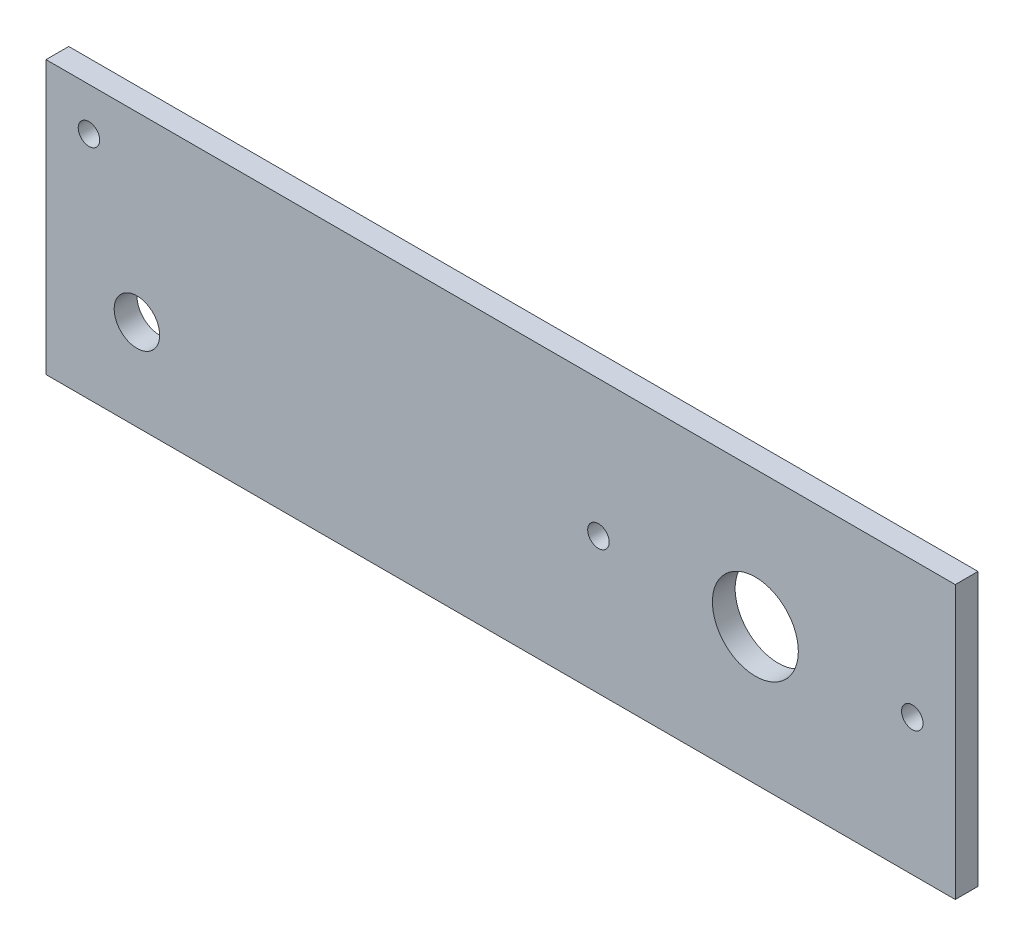
ISO-10303-21;
HEADER;
FILE_DESCRIPTION(('STEP AP214'),'2;1');
FILE_NAME('part.step','',(''),(''),'','','');
FILE_SCHEMA(('AUTOMOTIVE_DESIGN { 1 0 10303 214 1 1 1 1 }'));
ENDSEC;
DATA;
#1=APPLICATION_CONTEXT('core data for automotive mechanical design processes');
#2=APPLICATION_PROTOCOL_DEFINITION('international standard','automotive_design',2000,#1);
#3=PRODUCT_CONTEXT('',#1,'mechanical');
#4=PRODUCT('Part','Part','',(#3));
#5=PRODUCT_RELATED_PRODUCT_CATEGORY('part','',(#4));
#6=PRODUCT_DEFINITION_FORMATION('','',#4);
#7=PRODUCT_DEFINITION_CONTEXT('part definition',#1,'design');
#8=PRODUCT_DEFINITION('design','',#6,#7);
#9=PRODUCT_DEFINITION_SHAPE('','',#8);
#10=(LENGTH_UNIT() NAMED_UNIT(*) SI_UNIT(.MILLI.,.METRE.));
#11=(NAMED_UNIT(*) PLANE_ANGLE_UNIT() SI_UNIT($,.RADIAN.));
#12=(NAMED_UNIT(*) SI_UNIT($,.STERADIAN.) SOLID_ANGLE_UNIT());
#13=UNCERTAINTY_MEASURE_WITH_UNIT(LENGTH_MEASURE(1.E-05),#10,'distance_accuracy_value','');
#14=(GEOMETRIC_REPRESENTATION_CONTEXT(3) GLOBAL_UNCERTAINTY_ASSIGNED_CONTEXT((#13)) GLOBAL_UNIT_ASSIGNED_CONTEXT((#10,
#11,#12)) REPRESENTATION_CONTEXT('',''));
#15=CARTESIAN_POINT('',(0.,0.,0.));
#16=DIRECTION('',(0.,0.,1.));
#17=DIRECTION('',(1.,0.,0.));
#18=AXIS2_PLACEMENT_3D('',#15,#16,#17);
#19=CARTESIAN_POINT('',(127.,0.,0.));
#20=DIRECTION('',(0.,0.,-1.));
#21=DIRECTION('',(-1.,0.,0.));
#22=AXIS2_PLACEMENT_3D('',#19,#20,#21);
#23=PLANE('',#22);
#24=CARTESIAN_POINT('',(6.,32.1,0.));
#25=DIRECTION('',(0.,0.,1.));
#26=DIRECTION('',(1.,0.,0.));
#27=AXIS2_PLACEMENT_3D('',#24,#25,#26);
#28=CIRCLE('',#27,1.5);
#29=CARTESIAN_POINT('',(7.5,32.1,0.));
#30=VERTEX_POINT('',#29);
#31=EDGE_CURVE('E133',#30,#30,#28,.T.);
#32=ORIENTED_EDGE('',*,*,#31,.F.);
#33=EDGE_LOOP('',(#32));
#34=FACE_BOUND('',#33,.T.);
#35=CARTESIAN_POINT('',(77.159379566434,19.05,0.));
#36=DIRECTION('',(0.,0.,1.));
#37=DIRECTION('',(1.,0.,0.));
#38=AXIS2_PLACEMENT_3D('',#35,#36,#37);
#39=CIRCLE('',#38,1.5);
#40=CARTESIAN_POINT('',(78.659379566434,19.05,0.));
#41=VERTEX_POINT('',#40);
#42=EDGE_CURVE('E127',#41,#41,#39,.T.);
#43=ORIENTED_EDGE('',*,*,#42,.F.);
#44=EDGE_LOOP('',(#43));
#45=FACE_BOUND('',#44,.T.);
#46=CARTESIAN_POINT('',(99.079689783217,19.05,0.));
#47=DIRECTION('',(0.,0.,1.));
#48=DIRECTION('',(1.,0.,0.));
#49=AXIS2_PLACEMENT_3D('',#46,#47,#48);
#50=CIRCLE('',#49,6.);
#51=CARTESIAN_POINT('',(105.079689783217,19.05,0.));
#52=VERTEX_POINT('',#51);
#53=EDGE_CURVE('E121',#52,#52,#50,.T.);
#54=ORIENTED_EDGE('',*,*,#53,.F.);
#55=EDGE_LOOP('',(#54));
#56=FACE_BOUND('',#55,.T.);
#57=CARTESIAN_POINT('',(121.,19.05,0.));
#58=DIRECTION('',(0.,0.,1.));
#59=DIRECTION('',(1.,0.,0.));
#60=AXIS2_PLACEMENT_3D('',#57,#58,#59);
#61=CIRCLE('',#60,1.5);
#62=CARTESIAN_POINT('',(122.5,19.05,0.));
#63=VERTEX_POINT('',#62);
#64=EDGE_CURVE('E115',#63,#63,#61,.T.);
#65=ORIENTED_EDGE('',*,*,#64,.F.);
#66=EDGE_LOOP('',(#65));
#67=FACE_BOUND('',#66,.T.);
#68=CARTESIAN_POINT('',(12.7,12.7,0.));
#69=DIRECTION('',(0.,0.,1.));
#70=DIRECTION('',(1.,0.,0.));
#71=AXIS2_PLACEMENT_3D('',#68,#69,#70);
#72=CIRCLE('',#71,3.175);
#73=CARTESIAN_POINT('',(15.875,12.7,0.));
#74=VERTEX_POINT('',#73);
#75=EDGE_CURVE('E109',#74,#74,#72,.T.);
#76=ORIENTED_EDGE('',*,*,#75,.F.);
#77=EDGE_LOOP('',(#76));
#78=FACE_BOUND('',#77,.T.);
#79=DIRECTION('',(0.,-1.,0.));
#80=VECTOR('',#79,1.);
#81=CARTESIAN_POINT('',(0.,0.,0.));
#82=LINE('',#81,#80);
#83=CARTESIAN_POINT('',(0.,38.1,0.));
#84=VERTEX_POINT('',#83);
#85=CARTESIAN_POINT('',(0.,0.,0.));
#86=VERTEX_POINT('',#85);
#87=EDGE_CURVE('E95',#84,#86,#82,.T.);
#88=ORIENTED_EDGE('',*,*,#87,.T.);
#89=DIRECTION('',(-1.,0.,0.));
#90=VECTOR('',#89,1.);
#91=CARTESIAN_POINT('',(127.,0.,0.));
#92=LINE('',#91,#90);
#93=CARTESIAN_POINT('',(127.,0.,0.));
#94=VERTEX_POINT('',#93);
#95=EDGE_CURVE('E11',#94,#86,#92,.T.);
#96=ORIENTED_EDGE('',*,*,#95,.F.);
#97=DIRECTION('',(0.,-1.,0.));
#98=VECTOR('',#97,1.);
#99=CARTESIAN_POINT('',(127.,0.,0.));
#100=LINE('',#99,#98);
#101=CARTESIAN_POINT('',(127.,38.1,0.));
#102=VERTEX_POINT('',#101);
#103=EDGE_CURVE('E83',#102,#94,#100,.T.);
#104=ORIENTED_EDGE('',*,*,#103,.F.);
#105=DIRECTION('',(-1.,0.,0.));
#106=VECTOR('',#105,1.);
#107=CARTESIAN_POINT('',(127.,38.1,0.));
#108=LINE('',#107,#106);
#109=EDGE_CURVE('E91',#102,#84,#108,.T.);
#110=ORIENTED_EDGE('',*,*,#109,.T.);
#111=EDGE_LOOP('',(#88,#96,#104,#110));
#112=FACE_BOUND('',#111,.T.);
#113=ADVANCED_FACE('F32',(#34,#45,#56,#67,#78,#112),#23,.F.);
#114=CARTESIAN_POINT('',(127.,0.,0.));
#115=DIRECTION('',(0.,1.,0.));
#116=DIRECTION('',(0.,0.,1.));
#117=AXIS2_PLACEMENT_3D('',#114,#115,#116);
#118=PLANE('',#117);
#119=DIRECTION('',(0.,0.,-1.));
#120=VECTOR('',#119,1.);
#121=CARTESIAN_POINT('',(0.,0.,0.));
#122=LINE('',#121,#120);
#123=CARTESIAN_POINT('',(0.,0.,-3.175));
#124=VERTEX_POINT('',#123);
#125=EDGE_CURVE('E87',#86,#124,#122,.T.);
#126=ORIENTED_EDGE('',*,*,#125,.T.);
#127=DIRECTION('',(-1.,0.,0.));
#128=VECTOR('',#127,1.);
#129=CARTESIAN_POINT('',(127.,0.,-3.175));
#130=LINE('',#129,#128);
#131=CARTESIAN_POINT('',(127.,0.,-3.175));
#132=VERTEX_POINT('',#131);
#133=EDGE_CURVE('E40',#132,#124,#130,.T.);
#134=ORIENTED_EDGE('',*,*,#133,.F.);
#135=DIRECTION('',(0.,0.,-1.));
#136=VECTOR('',#135,1.);
#137=CARTESIAN_POINT('',(127.,0.,0.));
#138=LINE('',#137,#136);
#139=EDGE_CURVE('E78',#94,#132,#138,.T.);
#140=ORIENTED_EDGE('',*,*,#139,.F.);
#141=ORIENTED_EDGE('',*,*,#95,.T.);
#142=EDGE_LOOP('',(#126,#134,#140,#141));
#143=FACE_BOUND('',#142,.T.);
#144=ADVANCED_FACE('F86',(#143),#118,.F.);
#145=CARTESIAN_POINT('',(127.,0.,-3.175));
#146=DIRECTION('',(0.,0.,1.));
#147=DIRECTION('',(0.,-1.,0.));
#148=AXIS2_PLACEMENT_3D('',#145,#146,#147);
#149=PLANE('',#148);
#150=CARTESIAN_POINT('',(6.,32.1,-3.175));
#151=DIRECTION('',(0.,0.,1.));
#152=DIRECTION('',(1.,0.,0.));
#153=AXIS2_PLACEMENT_3D('',#150,#151,#152);
#154=CIRCLE('',#153,1.5);
#155=CARTESIAN_POINT('',(7.5,32.1,-3.175));
#156=VERTEX_POINT('',#155);
#157=EDGE_CURVE('E130',#156,#156,#154,.T.);
#158=ORIENTED_EDGE('',*,*,#157,.T.);
#159=EDGE_LOOP('',(#158));
#160=FACE_BOUND('',#159,.T.);
#161=CARTESIAN_POINT('',(77.159379566434,19.05,-3.175));
#162=DIRECTION('',(0.,0.,1.));
#163=DIRECTION('',(1.,0.,0.));
#164=AXIS2_PLACEMENT_3D('',#161,#162,#163);
#165=CIRCLE('',#164,1.5);
#166=CARTESIAN_POINT('',(78.659379566434,19.05,-3.175));
#167=VERTEX_POINT('',#166);
#168=EDGE_CURVE('E124',#167,#167,#165,.T.);
#169=ORIENTED_EDGE('',*,*,#168,.T.);
#170=EDGE_LOOP('',(#169));
#171=FACE_BOUND('',#170,.T.);
#172=CARTESIAN_POINT('',(99.079689783217,19.05,-3.175));
#173=DIRECTION('',(0.,0.,1.));
#174=DIRECTION('',(1.,0.,0.));
#175=AXIS2_PLACEMENT_3D('',#172,#173,#174);
#176=CIRCLE('',#175,6.);
#177=CARTESIAN_POINT('',(105.079689783217,19.05,-3.175));
#178=VERTEX_POINT('',#177);
#179=EDGE_CURVE('E118',#178,#178,#176,.T.);
#180=ORIENTED_EDGE('',*,*,#179,.T.);
#181=EDGE_LOOP('',(#180));
#182=FACE_BOUND('',#181,.T.);
#183=CARTESIAN_POINT('',(121.,19.05,-3.175));
#184=DIRECTION('',(0.,0.,1.));
#185=DIRECTION('',(1.,0.,0.));
#186=AXIS2_PLACEMENT_3D('',#183,#184,#185);
#187=CIRCLE('',#186,1.5);
#188=CARTESIAN_POINT('',(122.5,19.05,-3.175));
#189=VERTEX_POINT('',#188);
#190=EDGE_CURVE('E112',#189,#189,#187,.T.);
#191=ORIENTED_EDGE('',*,*,#190,.T.);
#192=EDGE_LOOP('',(#191));
#193=FACE_BOUND('',#192,.T.);
#194=CARTESIAN_POINT('',(12.7,12.7,-3.175));
#195=DIRECTION('',(0.,0.,1.));
#196=DIRECTION('',(1.,0.,0.));
#197=AXIS2_PLACEMENT_3D('',#194,#195,#196);
#198=CIRCLE('',#197,3.175);
#199=CARTESIAN_POINT('',(15.875,12.7,-3.175));
#200=VERTEX_POINT('',#199);
#201=EDGE_CURVE('E98',#200,#200,#198,.T.);
#202=ORIENTED_EDGE('',*,*,#201,.T.);
#203=EDGE_LOOP('',(#202));
#204=FACE_BOUND('',#203,.T.);
#205=DIRECTION('',(0.,1.,0.));
#206=VECTOR('',#205,1.);
#207=CARTESIAN_POINT('',(0.,0.,-3.175));
#208=LINE('',#207,#206);
#209=CARTESIAN_POINT('',(0.,38.1,-3.17499999999999));
#210=VERTEX_POINT('',#209);
#211=EDGE_CURVE('E65',#124,#210,#208,.T.);
#212=ORIENTED_EDGE('',*,*,#211,.T.);
#213=DIRECTION('',(-1.,0.,0.));
#214=VECTOR('',#213,1.);
#215=CARTESIAN_POINT('',(127.,38.1,-3.17499999999999));
#216=LINE('',#215,#214);
#217=CARTESIAN_POINT('',(127.,38.1,-3.17499999999999));
#218=VERTEX_POINT('',#217);
#219=EDGE_CURVE('E88',#218,#210,#216,.T.);
#220=ORIENTED_EDGE('',*,*,#219,.F.);
#221=DIRECTION('',(0.,1.,0.));
#222=VECTOR('',#221,1.);
#223=CARTESIAN_POINT('',(127.,0.,-3.175));
#224=LINE('',#223,#222);
#225=EDGE_CURVE('E81',#132,#218,#224,.T.);
#226=ORIENTED_EDGE('',*,*,#225,.F.);
#227=ORIENTED_EDGE('',*,*,#133,.T.);
#228=EDGE_LOOP('',(#212,#220,#226,#227));
#229=FACE_BOUND('',#228,.T.);
#230=ADVANCED_FACE('F89',(#160,#171,#182,#193,#204,#229),#149,.F.);
#231=CARTESIAN_POINT('',(127.,38.1,0.));
#232=DIRECTION('',(0.,-1.,0.));
#233=DIRECTION('',(0.,0.,-1.));
#234=AXIS2_PLACEMENT_3D('',#231,#232,#233);
#235=PLANE('',#234);
#236=DIRECTION('',(0.,0.,1.));
#237=VECTOR('',#236,1.);
#238=CARTESIAN_POINT('',(0.,38.1,0.));
#239=LINE('',#238,#237);
#240=EDGE_CURVE('E71',#210,#84,#239,.T.);
#241=ORIENTED_EDGE('',*,*,#240,.T.);
#242=ORIENTED_EDGE('',*,*,#109,.F.);
#243=DIRECTION('',(0.,0.,1.));
#244=VECTOR('',#243,1.);
#245=CARTESIAN_POINT('',(127.,38.1,0.));
#246=LINE('',#245,#244);
#247=EDGE_CURVE('E48',#218,#102,#246,.T.);
#248=ORIENTED_EDGE('',*,*,#247,.F.);
#249=ORIENTED_EDGE('',*,*,#219,.T.);
#250=EDGE_LOOP('',(#241,#242,#248,#249));
#251=FACE_BOUND('',#250,.T.);
#252=ADVANCED_FACE('F103',(#251),#235,.F.);
#253=CARTESIAN_POINT('',(127.,0.,0.));
#254=DIRECTION('',(-1.,0.,0.));
#255=DIRECTION('',(0.,0.,1.));
#256=AXIS2_PLACEMENT_3D('',#253,#254,#255);
#257=PLANE('',#256);
#258=ORIENTED_EDGE('',*,*,#103,.T.);
#259=ORIENTED_EDGE('',*,*,#139,.T.);
#260=ORIENTED_EDGE('',*,*,#225,.T.);
#261=ORIENTED_EDGE('',*,*,#247,.T.);
#262=EDGE_LOOP('',(#258,#259,#260,#261));
#263=FACE_BOUND('',#262,.T.);
#264=ADVANCED_FACE('F79',(#263),#257,.F.);
#265=CARTESIAN_POINT('',(0.,0.,0.));
#266=DIRECTION('',(-1.,0.,0.));
#267=DIRECTION('',(0.,0.,1.));
#268=AXIS2_PLACEMENT_3D('',#265,#266,#267);
#269=PLANE('',#268);
#270=ORIENTED_EDGE('',*,*,#87,.F.);
#271=ORIENTED_EDGE('',*,*,#240,.F.);
#272=ORIENTED_EDGE('',*,*,#211,.F.);
#273=ORIENTED_EDGE('',*,*,#125,.F.);
#274=EDGE_LOOP('',(#270,#271,#272,#273));
#275=FACE_BOUND('',#274,.T.);
#276=ADVANCED_FACE('F106',(#275),#269,.T.);
#277=CARTESIAN_POINT('',(12.7,12.7,-3.175));
#278=DIRECTION('',(0.,0.,1.));
#279=DIRECTION('',(1.,0.,0.));
#280=AXIS2_PLACEMENT_3D('',#277,#278,#279);
#281=CYLINDRICAL_SURFACE('',#280,3.175);
#282=ORIENTED_EDGE('',*,*,#201,.F.);
#283=EDGE_LOOP('',(#282));
#284=FACE_BOUND('',#283,.T.);
#285=ORIENTED_EDGE('',*,*,#75,.T.);
#286=EDGE_LOOP('',(#285));
#287=FACE_BOUND('',#286,.T.);
#288=ADVANCED_FACE('F158',(#284,#287),#281,.F.);
#289=CARTESIAN_POINT('',(121.,19.05,-3.175));
#290=DIRECTION('',(0.,0.,1.));
#291=DIRECTION('',(1.,0.,0.));
#292=AXIS2_PLACEMENT_3D('',#289,#290,#291);
#293=CYLINDRICAL_SURFACE('',#292,1.5);
#294=ORIENTED_EDGE('',*,*,#190,.F.);
#295=EDGE_LOOP('',(#294));
#296=FACE_BOUND('',#295,.T.);
#297=ORIENTED_EDGE('',*,*,#64,.T.);
#298=EDGE_LOOP('',(#297));
#299=FACE_BOUND('',#298,.T.);
#300=ADVANCED_FACE('F160',(#296,#299),#293,.F.);
#301=CARTESIAN_POINT('',(99.079689783217,19.05,-3.175));
#302=DIRECTION('',(0.,0.,1.));
#303=DIRECTION('',(1.,0.,0.));
#304=AXIS2_PLACEMENT_3D('',#301,#302,#303);
#305=CYLINDRICAL_SURFACE('',#304,6.);
#306=ORIENTED_EDGE('',*,*,#179,.F.);
#307=EDGE_LOOP('',(#306));
#308=FACE_BOUND('',#307,.T.);
#309=ORIENTED_EDGE('',*,*,#53,.T.);
#310=EDGE_LOOP('',(#309));
#311=FACE_BOUND('',#310,.T.);
#312=ADVANCED_FACE('F167',(#308,#311),#305,.F.);
#313=CARTESIAN_POINT('',(77.159379566434,19.05,-3.175));
#314=DIRECTION('',(0.,0.,1.));
#315=DIRECTION('',(1.,0.,0.));
#316=AXIS2_PLACEMENT_3D('',#313,#314,#315);
#317=CYLINDRICAL_SURFACE('',#316,1.5);
#318=ORIENTED_EDGE('',*,*,#168,.F.);
#319=EDGE_LOOP('',(#318));
#320=FACE_BOUND('',#319,.T.);
#321=ORIENTED_EDGE('',*,*,#42,.T.);
#322=EDGE_LOOP('',(#321));
#323=FACE_BOUND('',#322,.T.);
#324=ADVANCED_FACE('F144',(#320,#323),#317,.F.);
#325=CARTESIAN_POINT('',(6.,32.1,-3.175));
#326=DIRECTION('',(0.,0.,1.));
#327=DIRECTION('',(1.,0.,0.));
#328=AXIS2_PLACEMENT_3D('',#325,#326,#327);
#329=CYLINDRICAL_SURFACE('',#328,1.5);
#330=ORIENTED_EDGE('',*,*,#157,.F.);
#331=EDGE_LOOP('',(#330));
#332=FACE_BOUND('',#331,.T.);
#333=ORIENTED_EDGE('',*,*,#31,.T.);
#334=EDGE_LOOP('',(#333));
#335=FACE_BOUND('',#334,.T.);
#336=ADVANCED_FACE('F141',(#332,#335),#329,.F.);
#337=CLOSED_SHELL('',(#113,#144,#230,#252,#264,#276,#288,#300,#312,#324,#336));
#338=MANIFOLD_SOLID_BREP('B2',#337);
#339=ADVANCED_BREP_SHAPE_REPRESENTATION('',(#18,#338),#14);
#340=SHAPE_DEFINITION_REPRESENTATION(#9,#339);
ENDSEC;
END-ISO-10303-21;
